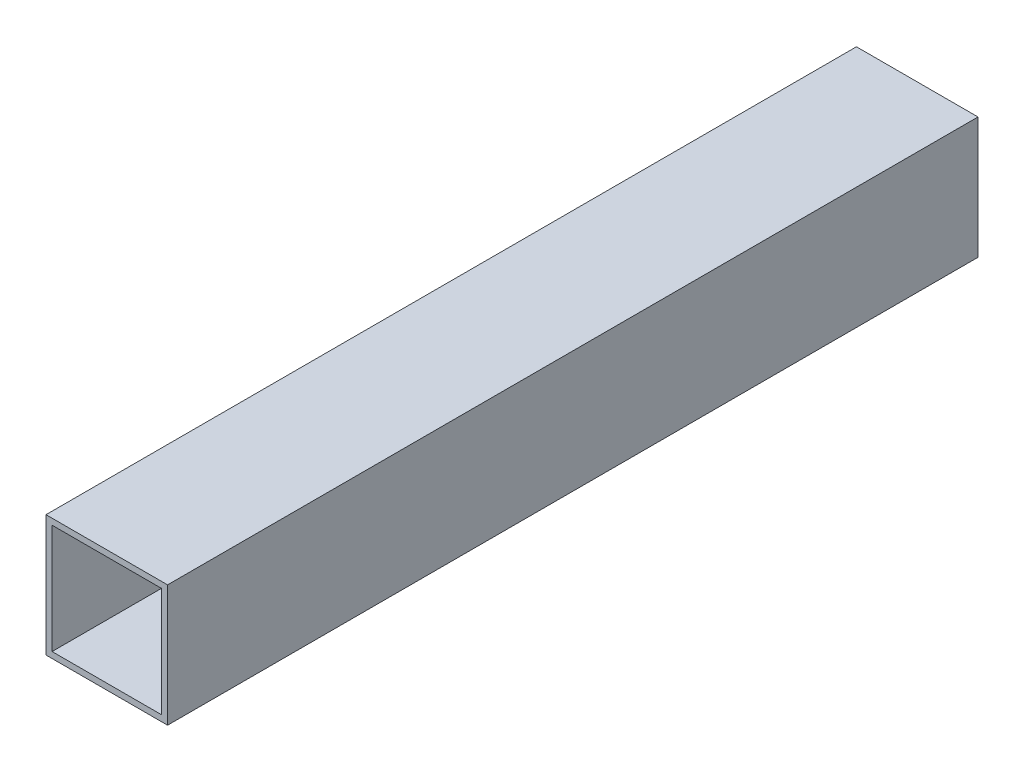
ISO-10303-21;
HEADER;
FILE_DESCRIPTION(('STEP AP214'),'2;1');
FILE_NAME('part.step','',(''),(''),'','','');
FILE_SCHEMA(('AUTOMOTIVE_DESIGN { 1 0 10303 214 1 1 1 1 }'));
ENDSEC;
DATA;
#1=APPLICATION_CONTEXT('core data for automotive mechanical design processes');
#2=APPLICATION_PROTOCOL_DEFINITION('international standard','automotive_design',2000,#1);
#3=PRODUCT_CONTEXT('',#1,'mechanical');
#4=PRODUCT('Part','Part','',(#3));
#5=PRODUCT_RELATED_PRODUCT_CATEGORY('part','',(#4));
#6=PRODUCT_DEFINITION_FORMATION('','',#4);
#7=PRODUCT_DEFINITION_CONTEXT('part definition',#1,'design');
#8=PRODUCT_DEFINITION('design','',#6,#7);
#9=PRODUCT_DEFINITION_SHAPE('','',#8);
#10=(LENGTH_UNIT() NAMED_UNIT(*) SI_UNIT(.MILLI.,.METRE.));
#11=(NAMED_UNIT(*) PLANE_ANGLE_UNIT() SI_UNIT($,.RADIAN.));
#12=(NAMED_UNIT(*) SI_UNIT($,.STERADIAN.) SOLID_ANGLE_UNIT());
#13=UNCERTAINTY_MEASURE_WITH_UNIT(LENGTH_MEASURE(1.E-05),#10,'distance_accuracy_value','');
#14=(GEOMETRIC_REPRESENTATION_CONTEXT(3) GLOBAL_UNCERTAINTY_ASSIGNED_CONTEXT((#13)) GLOBAL_UNIT_ASSIGNED_CONTEXT((#10,
#11,#12)) REPRESENTATION_CONTEXT('',''));
#15=CARTESIAN_POINT('',(0.,0.,0.));
#16=DIRECTION('',(0.,0.,1.));
#17=DIRECTION('',(1.,0.,0.));
#18=AXIS2_PLACEMENT_3D('',#15,#16,#17);
#19=CARTESIAN_POINT('',(0.,0.,200.));
#20=DIRECTION('',(0.,0.,-1.));
#21=DIRECTION('',(-1.,0.,0.));
#22=AXIS2_PLACEMENT_3D('',#19,#20,#21);
#23=PLANE('',#22);
#24=DIRECTION('',(0.,-1.,0.));
#25=VECTOR('',#24,1.);
#26=CARTESIAN_POINT('',(0.,0.,200.));
#27=LINE('',#26,#25);
#28=CARTESIAN_POINT('',(0.,30.,200.));
#29=VERTEX_POINT('',#28);
#30=CARTESIAN_POINT('',(0.,0.,200.));
#31=VERTEX_POINT('',#30);
#32=EDGE_CURVE('E142',#29,#31,#27,.T.);
#33=ORIENTED_EDGE('',*,*,#32,.T.);
#34=DIRECTION('',(1.,0.,0.));
#35=VECTOR('',#34,1.);
#36=CARTESIAN_POINT('',(0.,0.,200.));
#37=LINE('',#36,#35);
#38=CARTESIAN_POINT('',(30.,0.,200.));
#39=VERTEX_POINT('',#38);
#40=EDGE_CURVE('E145',#31,#39,#37,.T.);
#41=ORIENTED_EDGE('',*,*,#40,.T.);
#42=DIRECTION('',(0.,1.,0.));
#43=VECTOR('',#42,1.);
#44=CARTESIAN_POINT('',(30.,0.,200.));
#45=LINE('',#44,#43);
#46=CARTESIAN_POINT('',(30.,30.,200.));
#47=VERTEX_POINT('',#46);
#48=EDGE_CURVE('E148',#39,#47,#45,.T.);
#49=ORIENTED_EDGE('',*,*,#48,.T.);
#50=DIRECTION('',(-1.,0.,0.));
#51=VECTOR('',#50,1.);
#52=CARTESIAN_POINT('',(0.,30.,200.));
#53=LINE('',#52,#51);
#54=EDGE_CURVE('E150',#47,#29,#53,.T.);
#55=ORIENTED_EDGE('',*,*,#54,.T.);
#56=EDGE_LOOP('',(#33,#41,#49,#55));
#57=FACE_BOUND('',#56,.T.);
#58=DIRECTION('',(0.,-1.,0.));
#59=VECTOR('',#58,1.);
#60=CARTESIAN_POINT('',(1.5,1.5,200.));
#61=LINE('',#60,#59);
#62=CARTESIAN_POINT('',(1.5,28.5,200.));
#63=VERTEX_POINT('',#62);
#64=CARTESIAN_POINT('',(1.5,1.5,200.));
#65=VERTEX_POINT('',#64);
#66=EDGE_CURVE('E106',#63,#65,#61,.T.);
#67=ORIENTED_EDGE('',*,*,#66,.F.);
#68=DIRECTION('',(-1.,0.,0.));
#69=VECTOR('',#68,1.);
#70=CARTESIAN_POINT('',(1.5,28.5,200.));
#71=LINE('',#70,#69);
#72=CARTESIAN_POINT('',(28.5,28.5,200.));
#73=VERTEX_POINT('',#72);
#74=EDGE_CURVE('E128',#73,#63,#71,.T.);
#75=ORIENTED_EDGE('',*,*,#74,.F.);
#76=DIRECTION('',(0.,1.,0.));
#77=VECTOR('',#76,1.);
#78=CARTESIAN_POINT('',(28.5,1.5,200.));
#79=LINE('',#78,#77);
#80=CARTESIAN_POINT('',(28.5,1.5,200.));
#81=VERTEX_POINT('',#80);
#82=EDGE_CURVE('E126',#81,#73,#79,.T.);
#83=ORIENTED_EDGE('',*,*,#82,.F.);
#84=DIRECTION('',(1.,0.,0.));
#85=VECTOR('',#84,1.);
#86=CARTESIAN_POINT('',(1.5,1.5,200.));
#87=LINE('',#86,#85);
#88=EDGE_CURVE('E114',#65,#81,#87,.T.);
#89=ORIENTED_EDGE('',*,*,#88,.F.);
#90=EDGE_LOOP('',(#67,#75,#83,#89));
#91=FACE_BOUND('',#90,.T.);
#92=ADVANCED_FACE('F41',(#57,#91),#23,.F.);
#93=CARTESIAN_POINT('',(0.,0.,0.));
#94=DIRECTION('',(0.,0.,-1.));
#95=DIRECTION('',(-1.,0.,0.));
#96=AXIS2_PLACEMENT_3D('',#93,#94,#95);
#97=PLANE('',#96);
#98=DIRECTION('',(0.,-1.,0.));
#99=VECTOR('',#98,1.);
#100=CARTESIAN_POINT('',(0.,0.,0.));
#101=LINE('',#100,#99);
#102=CARTESIAN_POINT('',(0.,30.,0.));
#103=VERTEX_POINT('',#102);
#104=CARTESIAN_POINT('',(0.,0.,0.));
#105=VERTEX_POINT('',#104);
#106=EDGE_CURVE('E122',#103,#105,#101,.T.);
#107=ORIENTED_EDGE('',*,*,#106,.F.);
#108=DIRECTION('',(-1.,0.,0.));
#109=VECTOR('',#108,1.);
#110=CARTESIAN_POINT('',(0.,30.,0.));
#111=LINE('',#110,#109);
#112=CARTESIAN_POINT('',(30.,30.,0.));
#113=VERTEX_POINT('',#112);
#114=EDGE_CURVE('E146',#113,#103,#111,.T.);
#115=ORIENTED_EDGE('',*,*,#114,.F.);
#116=DIRECTION('',(0.,1.,0.));
#117=VECTOR('',#116,1.);
#118=CARTESIAN_POINT('',(30.,0.,0.));
#119=LINE('',#118,#117);
#120=CARTESIAN_POINT('',(30.,0.,0.));
#121=VERTEX_POINT('',#120);
#122=EDGE_CURVE('E157',#121,#113,#119,.T.);
#123=ORIENTED_EDGE('',*,*,#122,.F.);
#124=DIRECTION('',(1.,0.,0.));
#125=VECTOR('',#124,1.);
#126=CARTESIAN_POINT('',(0.,0.,0.));
#127=LINE('',#126,#125);
#128=EDGE_CURVE('E155',#105,#121,#127,.T.);
#129=ORIENTED_EDGE('',*,*,#128,.F.);
#130=EDGE_LOOP('',(#107,#115,#123,#129));
#131=FACE_BOUND('',#130,.T.);
#132=DIRECTION('',(-1.,0.,0.));
#133=VECTOR('',#132,1.);
#134=CARTESIAN_POINT('',(1.5,28.5,0.));
#135=LINE('',#134,#133);
#136=CARTESIAN_POINT('',(28.5,28.5,0.));
#137=VERTEX_POINT('',#136);
#138=CARTESIAN_POINT('',(1.5,28.5,0.));
#139=VERTEX_POINT('',#138);
#140=EDGE_CURVE('E115',#137,#139,#135,.T.);
#141=ORIENTED_EDGE('',*,*,#140,.T.);
#142=DIRECTION('',(0.,-1.,0.));
#143=VECTOR('',#142,1.);
#144=CARTESIAN_POINT('',(1.5,1.5,0.));
#145=LINE('',#144,#143);
#146=CARTESIAN_POINT('',(1.5,1.5,0.));
#147=VERTEX_POINT('',#146);
#148=EDGE_CURVE('E64',#139,#147,#145,.T.);
#149=ORIENTED_EDGE('',*,*,#148,.T.);
#150=DIRECTION('',(1.,0.,0.));
#151=VECTOR('',#150,1.);
#152=CARTESIAN_POINT('',(1.5,1.5,0.));
#153=LINE('',#152,#151);
#154=CARTESIAN_POINT('',(28.5,1.5,0.));
#155=VERTEX_POINT('',#154);
#156=EDGE_CURVE('E121',#147,#155,#153,.T.);
#157=ORIENTED_EDGE('',*,*,#156,.T.);
#158=DIRECTION('',(0.,1.,0.));
#159=VECTOR('',#158,1.);
#160=CARTESIAN_POINT('',(28.5,1.5,0.));
#161=LINE('',#160,#159);
#162=EDGE_CURVE('E134',#155,#137,#161,.T.);
#163=ORIENTED_EDGE('',*,*,#162,.T.);
#164=EDGE_LOOP('',(#141,#149,#157,#163));
#165=FACE_BOUND('',#164,.T.);
#166=ADVANCED_FACE('F175',(#131,#165),#97,.T.);
#167=CARTESIAN_POINT('',(0.,0.,200.));
#168=DIRECTION('',(1.,0.,0.));
#169=DIRECTION('',(0.,0.,-1.));
#170=AXIS2_PLACEMENT_3D('',#167,#168,#169);
#171=PLANE('',#170);
#172=ORIENTED_EDGE('',*,*,#106,.T.);
#173=DIRECTION('',(0.,0.,-1.));
#174=VECTOR('',#173,1.);
#175=CARTESIAN_POINT('',(0.,0.,200.));
#176=LINE('',#175,#174);
#177=EDGE_CURVE('E11',#31,#105,#176,.T.);
#178=ORIENTED_EDGE('',*,*,#177,.F.);
#179=ORIENTED_EDGE('',*,*,#32,.F.);
#180=DIRECTION('',(0.,0.,-1.));
#181=VECTOR('',#180,1.);
#182=CARTESIAN_POINT('',(0.,30.,200.));
#183=LINE('',#182,#181);
#184=EDGE_CURVE('E152',#29,#103,#183,.T.);
#185=ORIENTED_EDGE('',*,*,#184,.T.);
#186=EDGE_LOOP('',(#172,#178,#179,#185));
#187=FACE_BOUND('',#186,.T.);
#188=ADVANCED_FACE('F43',(#187),#171,.F.);
#189=CARTESIAN_POINT('',(0.,0.,200.));
#190=DIRECTION('',(0.,1.,0.));
#191=DIRECTION('',(0.,0.,1.));
#192=AXIS2_PLACEMENT_3D('',#189,#190,#191);
#193=PLANE('',#192);
#194=ORIENTED_EDGE('',*,*,#128,.T.);
#195=DIRECTION('',(0.,0.,-1.));
#196=VECTOR('',#195,1.);
#197=CARTESIAN_POINT('',(30.,0.,200.));
#198=LINE('',#197,#196);
#199=EDGE_CURVE('E49',#39,#121,#198,.T.);
#200=ORIENTED_EDGE('',*,*,#199,.F.);
#201=ORIENTED_EDGE('',*,*,#40,.F.);
#202=ORIENTED_EDGE('',*,*,#177,.T.);
#203=EDGE_LOOP('',(#194,#200,#201,#202));
#204=FACE_BOUND('',#203,.T.);
#205=ADVANCED_FACE('F185',(#204),#193,.F.);
#206=CARTESIAN_POINT('',(30.,0.,200.));
#207=DIRECTION('',(-1.,0.,0.));
#208=DIRECTION('',(0.,0.,1.));
#209=AXIS2_PLACEMENT_3D('',#206,#207,#208);
#210=PLANE('',#209);
#211=ORIENTED_EDGE('',*,*,#122,.T.);
#212=DIRECTION('',(0.,0.,-1.));
#213=VECTOR('',#212,1.);
#214=CARTESIAN_POINT('',(30.,30.,200.));
#215=LINE('',#214,#213);
#216=EDGE_CURVE('E162',#47,#113,#215,.T.);
#217=ORIENTED_EDGE('',*,*,#216,.F.);
#218=ORIENTED_EDGE('',*,*,#48,.F.);
#219=ORIENTED_EDGE('',*,*,#199,.T.);
#220=EDGE_LOOP('',(#211,#217,#218,#219));
#221=FACE_BOUND('',#220,.T.);
#222=ADVANCED_FACE('F169',(#221),#210,.F.);
#223=CARTESIAN_POINT('',(0.,30.,200.));
#224=DIRECTION('',(0.,-1.,0.));
#225=DIRECTION('',(0.,0.,-1.));
#226=AXIS2_PLACEMENT_3D('',#223,#224,#225);
#227=PLANE('',#226);
#228=ORIENTED_EDGE('',*,*,#114,.T.);
#229=ORIENTED_EDGE('',*,*,#184,.F.);
#230=ORIENTED_EDGE('',*,*,#54,.F.);
#231=ORIENTED_EDGE('',*,*,#216,.T.);
#232=EDGE_LOOP('',(#228,#229,#230,#231));
#233=FACE_BOUND('',#232,.T.);
#234=ADVANCED_FACE('F179',(#233),#227,.F.);
#235=CARTESIAN_POINT('',(1.5,1.5,200.));
#236=DIRECTION('',(1.,0.,0.));
#237=DIRECTION('',(0.,0.,-1.));
#238=AXIS2_PLACEMENT_3D('',#235,#236,#237);
#239=PLANE('',#238);
#240=ORIENTED_EDGE('',*,*,#148,.F.);
#241=DIRECTION('',(0.,0.,-1.));
#242=VECTOR('',#241,1.);
#243=CARTESIAN_POINT('',(1.5,28.5,200.));
#244=LINE('',#243,#242);
#245=EDGE_CURVE('E110',#63,#139,#244,.T.);
#246=ORIENTED_EDGE('',*,*,#245,.F.);
#247=ORIENTED_EDGE('',*,*,#66,.T.);
#248=DIRECTION('',(0.,0.,-1.));
#249=VECTOR('',#248,1.);
#250=CARTESIAN_POINT('',(1.5,1.5,200.));
#251=LINE('',#250,#249);
#252=EDGE_CURVE('E109',#65,#147,#251,.T.);
#253=ORIENTED_EDGE('',*,*,#252,.T.);
#254=EDGE_LOOP('',(#240,#246,#247,#253));
#255=FACE_BOUND('',#254,.T.);
#256=ADVANCED_FACE('F108',(#255),#239,.T.);
#257=CARTESIAN_POINT('',(1.5,1.5,200.));
#258=DIRECTION('',(0.,1.,0.));
#259=DIRECTION('',(0.,0.,1.));
#260=AXIS2_PLACEMENT_3D('',#257,#258,#259);
#261=PLANE('',#260);
#262=ORIENTED_EDGE('',*,*,#156,.F.);
#263=ORIENTED_EDGE('',*,*,#252,.F.);
#264=ORIENTED_EDGE('',*,*,#88,.T.);
#265=DIRECTION('',(0.,0.,-1.));
#266=VECTOR('',#265,1.);
#267=CARTESIAN_POINT('',(28.5,1.5,200.));
#268=LINE('',#267,#266);
#269=EDGE_CURVE('E123',#81,#155,#268,.T.);
#270=ORIENTED_EDGE('',*,*,#269,.T.);
#271=EDGE_LOOP('',(#262,#263,#264,#270));
#272=FACE_BOUND('',#271,.T.);
#273=ADVANCED_FACE('F118',(#272),#261,.T.);
#274=CARTESIAN_POINT('',(28.5,1.5,200.));
#275=DIRECTION('',(-1.,0.,0.));
#276=DIRECTION('',(0.,0.,1.));
#277=AXIS2_PLACEMENT_3D('',#274,#275,#276);
#278=PLANE('',#277);
#279=ORIENTED_EDGE('',*,*,#162,.F.);
#280=ORIENTED_EDGE('',*,*,#269,.F.);
#281=ORIENTED_EDGE('',*,*,#82,.T.);
#282=DIRECTION('',(0.,0.,-1.));
#283=VECTOR('',#282,1.);
#284=CARTESIAN_POINT('',(28.5,28.5,200.));
#285=LINE('',#284,#283);
#286=EDGE_CURVE('E56',#73,#137,#285,.T.);
#287=ORIENTED_EDGE('',*,*,#286,.T.);
#288=EDGE_LOOP('',(#279,#280,#281,#287));
#289=FACE_BOUND('',#288,.T.);
#290=ADVANCED_FACE('F208',(#289),#278,.T.);
#291=CARTESIAN_POINT('',(1.5,28.5,200.));
#292=DIRECTION('',(0.,-1.,0.));
#293=DIRECTION('',(0.,0.,-1.));
#294=AXIS2_PLACEMENT_3D('',#291,#292,#293);
#295=PLANE('',#294);
#296=ORIENTED_EDGE('',*,*,#140,.F.);
#297=ORIENTED_EDGE('',*,*,#286,.F.);
#298=ORIENTED_EDGE('',*,*,#74,.T.);
#299=ORIENTED_EDGE('',*,*,#245,.T.);
#300=EDGE_LOOP('',(#296,#297,#298,#299));
#301=FACE_BOUND('',#300,.T.);
#302=ADVANCED_FACE('F212',(#301),#295,.T.);
#303=CLOSED_SHELL('',(#92,#166,#188,#205,#222,#234,#256,#273,#290,#302));
#304=MANIFOLD_SOLID_BREP('B2',#303);
#305=ADVANCED_BREP_SHAPE_REPRESENTATION('',(#18,#304),#14);
#306=SHAPE_DEFINITION_REPRESENTATION(#9,#305);
ENDSEC;
END-ISO-10303-21;
